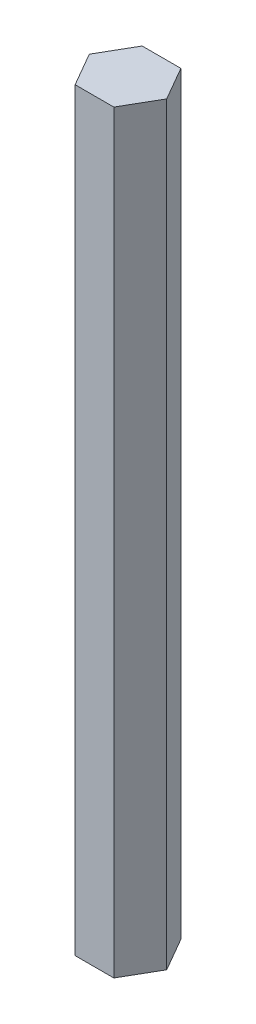
ISO-10303-21;
HEADER;
FILE_DESCRIPTION(('STEP AP214'),'2;1');
FILE_NAME('part.step','',(''),(''),'','','');
FILE_SCHEMA(('AUTOMOTIVE_DESIGN { 1 0 10303 214 1 1 1 1 }'));
ENDSEC;
DATA;
#1=APPLICATION_CONTEXT('core data for automotive mechanical design processes');
#2=APPLICATION_PROTOCOL_DEFINITION('international standard','automotive_design',2000,#1);
#3=PRODUCT_CONTEXT('',#1,'mechanical');
#4=PRODUCT('Part','Part','',(#3));
#5=PRODUCT_RELATED_PRODUCT_CATEGORY('part','',(#4));
#6=PRODUCT_DEFINITION_FORMATION('','',#4);
#7=PRODUCT_DEFINITION_CONTEXT('part definition',#1,'design');
#8=PRODUCT_DEFINITION('design','',#6,#7);
#9=PRODUCT_DEFINITION_SHAPE('','',#8);
#10=(LENGTH_UNIT() NAMED_UNIT(*) SI_UNIT(.MILLI.,.METRE.));
#11=(NAMED_UNIT(*) PLANE_ANGLE_UNIT() SI_UNIT($,.RADIAN.));
#12=(NAMED_UNIT(*) SI_UNIT($,.STERADIAN.) SOLID_ANGLE_UNIT());
#13=UNCERTAINTY_MEASURE_WITH_UNIT(LENGTH_MEASURE(1.E-05),#10,'distance_accuracy_value','');
#14=(GEOMETRIC_REPRESENTATION_CONTEXT(3) GLOBAL_UNCERTAINTY_ASSIGNED_CONTEXT((#13)) GLOBAL_UNIT_ASSIGNED_CONTEXT((#10,
#11,#12)) REPRESENTATION_CONTEXT('',''));
#15=CARTESIAN_POINT('',(0.,0.,0.));
#16=DIRECTION('',(0.,0.,1.));
#17=DIRECTION('',(1.,0.,0.));
#18=AXIS2_PLACEMENT_3D('',#15,#16,#17);
#19=CARTESIAN_POINT('',(3.6661742093542,142.875,6.34999999999996));
#20=DIRECTION('',(-0.866025403784441,0.,-0.499999999999995));
#21=DIRECTION('',(-0.499999999999995,0.,0.866025403784441));
#22=AXIS2_PLACEMENT_3D('',#19,#20,#21);
#23=PLANE('',#22);
#24=DIRECTION('',(0.499999999999995,0.,-0.866025403784441));
#25=VECTOR('',#24,1.);
#26=CARTESIAN_POINT('',(3.6661742093542,0.,6.34999999999996));
#27=LINE('',#26,#25);
#28=CARTESIAN_POINT('',(3.6661742093542,0.,6.34999999999996));
#29=VERTEX_POINT('',#28);
#30=CARTESIAN_POINT('',(7.33234841870825,0.,0.));
#31=VERTEX_POINT('',#30);
#32=EDGE_CURVE('E145',#29,#31,#27,.T.);
#33=ORIENTED_EDGE('',*,*,#32,.T.);
#34=DIRECTION('',(0.,-1.,0.));
#35=VECTOR('',#34,1.);
#36=CARTESIAN_POINT('',(7.33234841870825,142.875,0.));
#37=LINE('',#36,#35);
#38=CARTESIAN_POINT('',(7.33234841870825,142.875,0.));
#39=VERTEX_POINT('',#38);
#40=EDGE_CURVE('E11',#39,#31,#37,.T.);
#41=ORIENTED_EDGE('',*,*,#40,.F.);
#42=DIRECTION('',(0.499999999999995,0.,-0.866025403784441));
#43=VECTOR('',#42,1.);
#44=CARTESIAN_POINT('',(3.6661742093542,142.875,6.34999999999996));
#45=LINE('',#44,#43);
#46=CARTESIAN_POINT('',(3.6661742093542,142.875,6.34999999999996));
#47=VERTEX_POINT('',#46);
#48=EDGE_CURVE('E160',#47,#39,#45,.T.);
#49=ORIENTED_EDGE('',*,*,#48,.F.);
#50=DIRECTION('',(0.,-1.,0.));
#51=VECTOR('',#50,1.);
#52=CARTESIAN_POINT('',(3.6661742093542,142.875,6.34999999999996));
#53=LINE('',#52,#51);
#54=EDGE_CURVE('E141',#47,#29,#53,.T.);
#55=ORIENTED_EDGE('',*,*,#54,.T.);
#56=EDGE_LOOP('',(#33,#41,#49,#55));
#57=FACE_BOUND('',#56,.T.);
#58=ADVANCED_FACE('F45',(#57),#23,.F.);
#59=CARTESIAN_POINT('',(7.33234841870825,142.875,0.));
#60=DIRECTION('',(-0.866025403784438,0.,0.500000000000001));
#61=DIRECTION('',(0.500000000000001,0.,0.866025403784438));
#62=AXIS2_PLACEMENT_3D('',#59,#60,#61);
#63=PLANE('',#62);
#64=DIRECTION('',(-0.500000000000001,0.,-0.866025403784438));
#65=VECTOR('',#64,1.);
#66=CARTESIAN_POINT('',(7.33234841870825,0.,0.));
#67=LINE('',#66,#65);
#68=CARTESIAN_POINT('',(3.66617420935411,0.,-6.35000000000001));
#69=VERTEX_POINT('',#68);
#70=EDGE_CURVE('E148',#31,#69,#67,.T.);
#71=ORIENTED_EDGE('',*,*,#70,.T.);
#72=DIRECTION('',(0.,-1.,0.));
#73=VECTOR('',#72,1.);
#74=CARTESIAN_POINT('',(3.66617420935411,142.875,-6.35000000000001));
#75=LINE('',#74,#73);
#76=CARTESIAN_POINT('',(3.66617420935411,142.875,-6.35000000000001));
#77=VERTEX_POINT('',#76);
#78=EDGE_CURVE('E54',#77,#69,#75,.T.);
#79=ORIENTED_EDGE('',*,*,#78,.F.);
#80=DIRECTION('',(-0.500000000000001,0.,-0.866025403784438));
#81=VECTOR('',#80,1.);
#82=CARTESIAN_POINT('',(7.33234841870825,142.875,0.));
#83=LINE('',#82,#81);
#84=EDGE_CURVE('E107',#39,#77,#83,.T.);
#85=ORIENTED_EDGE('',*,*,#84,.F.);
#86=ORIENTED_EDGE('',*,*,#40,.T.);
#87=EDGE_LOOP('',(#71,#79,#85,#86));
#88=FACE_BOUND('',#87,.T.);
#89=ADVANCED_FACE('F188',(#88),#63,.F.);
#90=CARTESIAN_POINT('',(3.66617420935411,142.875,-6.35000000000001));
#91=DIRECTION('',(0.,0.,1.));
#92=DIRECTION('',(1.,0.,0.));
#93=AXIS2_PLACEMENT_3D('',#90,#91,#92);
#94=PLANE('',#93);
#95=DIRECTION('',(-1.,0.,0.));
#96=VECTOR('',#95,1.);
#97=CARTESIAN_POINT('',(3.66617420935411,0.,-6.35000000000001));
#98=LINE('',#97,#96);
#99=CARTESIAN_POINT('',(-3.66617420935416,0.,-6.34999999999999));
#100=VERTEX_POINT('',#99);
#101=EDGE_CURVE('E151',#69,#100,#98,.T.);
#102=ORIENTED_EDGE('',*,*,#101,.T.);
#103=DIRECTION('',(0.,-1.,0.));
#104=VECTOR('',#103,1.);
#105=CARTESIAN_POINT('',(-3.66617420935416,142.875,-6.34999999999999));
#106=LINE('',#105,#104);
#107=CARTESIAN_POINT('',(-3.66617420935416,142.875,-6.34999999999999));
#108=VERTEX_POINT('',#107);
#109=EDGE_CURVE('E133',#108,#100,#106,.T.);
#110=ORIENTED_EDGE('',*,*,#109,.F.);
#111=DIRECTION('',(-1.,0.,0.));
#112=VECTOR('',#111,1.);
#113=CARTESIAN_POINT('',(3.66617420935411,142.875,-6.35000000000001));
#114=LINE('',#113,#112);
#115=EDGE_CURVE('E122',#77,#108,#114,.T.);
#116=ORIENTED_EDGE('',*,*,#115,.F.);
#117=ORIENTED_EDGE('',*,*,#78,.T.);
#118=EDGE_LOOP('',(#102,#110,#116,#117));
#119=FACE_BOUND('',#118,.T.);
#120=ADVANCED_FACE('F170',(#119),#94,.F.);
#121=CARTESIAN_POINT('',(-3.66617420935416,142.875,-6.34999999999999));
#122=DIRECTION('',(0.866025403784442,0.,0.499999999999995));
#123=DIRECTION('',(0.499999999999995,0.,-0.866025403784442));
#124=AXIS2_PLACEMENT_3D('',#121,#122,#123);
#125=PLANE('',#124);
#126=DIRECTION('',(-0.499999999999995,0.,0.866025403784441));
#127=VECTOR('',#126,1.);
#128=CARTESIAN_POINT('',(-3.66617420935416,0.,-6.34999999999999));
#129=LINE('',#128,#127);
#130=CARTESIAN_POINT('',(-7.33234841870825,0.,0.));
#131=VERTEX_POINT('',#130);
#132=EDGE_CURVE('E131',#100,#131,#129,.T.);
#133=ORIENTED_EDGE('',*,*,#132,.T.);
#134=DIRECTION('',(0.,-1.,0.));
#135=VECTOR('',#134,1.);
#136=CARTESIAN_POINT('',(-7.33234841870825,142.875,0.));
#137=LINE('',#136,#135);
#138=CARTESIAN_POINT('',(-7.33234841870825,142.875,0.));
#139=VERTEX_POINT('',#138);
#140=EDGE_CURVE('E128',#139,#131,#137,.T.);
#141=ORIENTED_EDGE('',*,*,#140,.F.);
#142=DIRECTION('',(-0.499999999999995,0.,0.866025403784441));
#143=VECTOR('',#142,1.);
#144=CARTESIAN_POINT('',(-3.66617420935416,142.875,-6.34999999999999));
#145=LINE('',#144,#143);
#146=EDGE_CURVE('E116',#108,#139,#145,.T.);
#147=ORIENTED_EDGE('',*,*,#146,.F.);
#148=ORIENTED_EDGE('',*,*,#109,.T.);
#149=EDGE_LOOP('',(#133,#141,#147,#148));
#150=FACE_BOUND('',#149,.T.);
#151=ADVANCED_FACE('F129',(#150),#125,.F.);
#152=CARTESIAN_POINT('',(-7.33234841870825,142.875,0.));
#153=DIRECTION('',(0.866025403784435,0.,-0.500000000000007));
#154=DIRECTION('',(-0.500000000000007,0.,-0.866025403784435));
#155=AXIS2_PLACEMENT_3D('',#152,#153,#154);
#156=PLANE('',#155);
#157=DIRECTION('',(0.500000000000007,0.,0.866025403784435));
#158=VECTOR('',#157,1.);
#159=CARTESIAN_POINT('',(-7.33234841870825,0.,0.));
#160=LINE('',#159,#158);
#161=CARTESIAN_POINT('',(-3.66617420935407,0.,6.35000000000004));
#162=VERTEX_POINT('',#161);
#163=EDGE_CURVE('E91',#131,#162,#160,.T.);
#164=ORIENTED_EDGE('',*,*,#163,.T.);
#165=DIRECTION('',(0.,-1.,0.));
#166=VECTOR('',#165,1.);
#167=CARTESIAN_POINT('',(-3.66617420935407,142.875,6.35000000000004));
#168=LINE('',#167,#166);
#169=CARTESIAN_POINT('',(-3.66617420935407,142.875,6.35000000000004));
#170=VERTEX_POINT('',#169);
#171=EDGE_CURVE('E134',#170,#162,#168,.T.);
#172=ORIENTED_EDGE('',*,*,#171,.F.);
#173=DIRECTION('',(0.500000000000007,0.,0.866025403784435));
#174=VECTOR('',#173,1.);
#175=CARTESIAN_POINT('',(-7.33234841870825,142.875,0.));
#176=LINE('',#175,#174);
#177=EDGE_CURVE('E120',#139,#170,#176,.T.);
#178=ORIENTED_EDGE('',*,*,#177,.F.);
#179=ORIENTED_EDGE('',*,*,#140,.T.);
#180=EDGE_LOOP('',(#164,#172,#178,#179));
#181=FACE_BOUND('',#180,.T.);
#182=ADVANCED_FACE('F136',(#181),#156,.F.);
#183=CARTESIAN_POINT('',(-3.66617420935407,142.875,6.35000000000004));
#184=DIRECTION('',(0.,0.,-1.));
#185=DIRECTION('',(-1.,0.,0.));
#186=AXIS2_PLACEMENT_3D('',#183,#184,#185);
#187=PLANE('',#186);
#188=DIRECTION('',(1.,0.,0.));
#189=VECTOR('',#188,1.);
#190=CARTESIAN_POINT('',(-3.66617420935407,0.,6.35000000000004));
#191=LINE('',#190,#189);
#192=EDGE_CURVE('E97',#162,#29,#191,.T.);
#193=ORIENTED_EDGE('',*,*,#192,.T.);
#194=ORIENTED_EDGE('',*,*,#54,.F.);
#195=DIRECTION('',(1.,0.,0.));
#196=VECTOR('',#195,1.);
#197=CARTESIAN_POINT('',(-3.66617420935407,142.875,6.35000000000004));
#198=LINE('',#197,#196);
#199=EDGE_CURVE('E65',#170,#47,#198,.T.);
#200=ORIENTED_EDGE('',*,*,#199,.F.);
#201=ORIENTED_EDGE('',*,*,#171,.T.);
#202=EDGE_LOOP('',(#193,#194,#200,#201));
#203=FACE_BOUND('',#202,.T.);
#204=ADVANCED_FACE('F177',(#203),#187,.F.);
#205=CARTESIAN_POINT('',(0.,142.875,0.));
#206=DIRECTION('',(0.,1.,0.));
#207=DIRECTION('',(0.,0.,1.));
#208=AXIS2_PLACEMENT_3D('',#205,#206,#207);
#209=PLANE('',#208);
#210=ORIENTED_EDGE('',*,*,#48,.T.);
#211=ORIENTED_EDGE('',*,*,#84,.T.);
#212=ORIENTED_EDGE('',*,*,#115,.T.);
#213=ORIENTED_EDGE('',*,*,#146,.T.);
#214=ORIENTED_EDGE('',*,*,#177,.T.);
#215=ORIENTED_EDGE('',*,*,#199,.T.);
#216=EDGE_LOOP('',(#210,#211,#212,#213,#214,#215));
#217=FACE_BOUND('',#216,.T.);
#218=ADVANCED_FACE('F118',(#217),#209,.T.);
#219=CARTESIAN_POINT('',(0.,0.,0.));
#220=DIRECTION('',(0.,1.,0.));
#221=DIRECTION('',(0.,0.,1.));
#222=AXIS2_PLACEMENT_3D('',#219,#220,#221);
#223=PLANE('',#222);
#224=ORIENTED_EDGE('',*,*,#32,.F.);
#225=ORIENTED_EDGE('',*,*,#192,.F.);
#226=ORIENTED_EDGE('',*,*,#163,.F.);
#227=ORIENTED_EDGE('',*,*,#132,.F.);
#228=ORIENTED_EDGE('',*,*,#101,.F.);
#229=ORIENTED_EDGE('',*,*,#70,.F.);
#230=EDGE_LOOP('',(#224,#225,#226,#227,#228,#229));
#231=FACE_BOUND('',#230,.T.);
#232=ADVANCED_FACE('F173',(#231),#223,.F.);
#233=CLOSED_SHELL('',(#58,#89,#120,#151,#182,#204,#218,#232));
#234=MANIFOLD_SOLID_BREP('B2',#233);
#235=ADVANCED_BREP_SHAPE_REPRESENTATION('',(#18,#234),#14);
#236=SHAPE_DEFINITION_REPRESENTATION(#9,#235);
ENDSEC;
END-ISO-10303-21;
